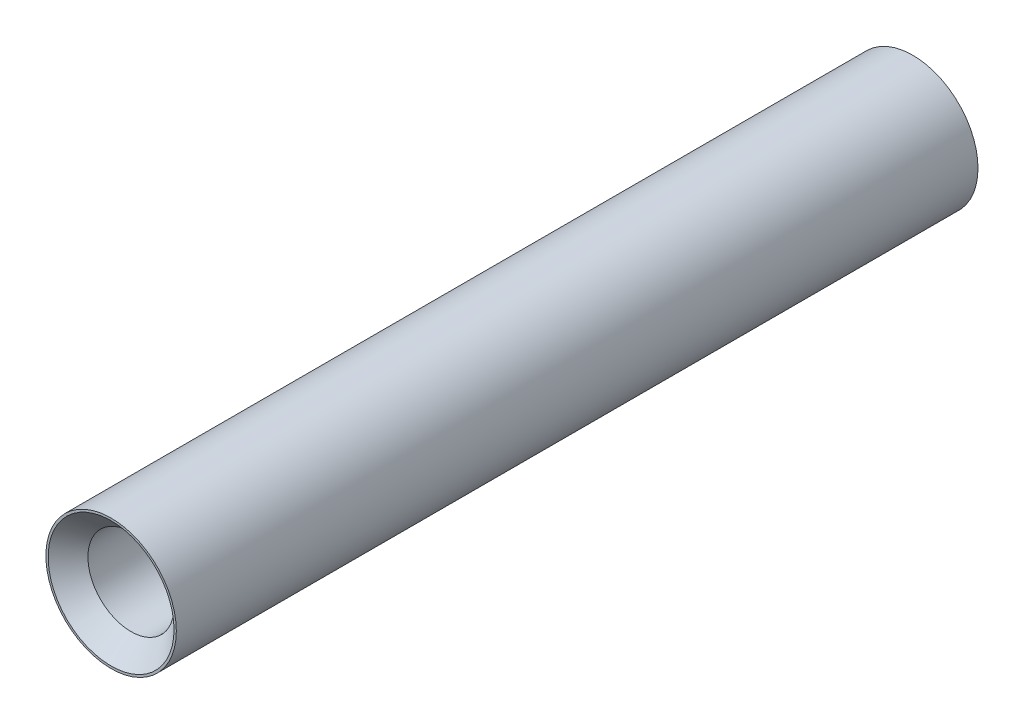
ISO-10303-21;
HEADER;
FILE_DESCRIPTION(('STEP AP214'),'2;1');
FILE_NAME('part.step','',(''),(''),'','','');
FILE_SCHEMA(('AUTOMOTIVE_DESIGN { 1 0 10303 214 1 1 1 1 }'));
ENDSEC;
DATA;
#1=APPLICATION_CONTEXT('core data for automotive mechanical design processes');
#2=APPLICATION_PROTOCOL_DEFINITION('international standard','automotive_design',2000,#1);
#3=PRODUCT_CONTEXT('',#1,'mechanical');
#4=PRODUCT('Part','Part','',(#3));
#5=PRODUCT_RELATED_PRODUCT_CATEGORY('part','',(#4));
#6=PRODUCT_DEFINITION_FORMATION('','',#4);
#7=PRODUCT_DEFINITION_CONTEXT('part definition',#1,'design');
#8=PRODUCT_DEFINITION('design','',#6,#7);
#9=PRODUCT_DEFINITION_SHAPE('','',#8);
#10=(LENGTH_UNIT() NAMED_UNIT(*) SI_UNIT(.MILLI.,.METRE.));
#11=(NAMED_UNIT(*) PLANE_ANGLE_UNIT() SI_UNIT($,.RADIAN.));
#12=(NAMED_UNIT(*) SI_UNIT($,.STERADIAN.) SOLID_ANGLE_UNIT());
#13=UNCERTAINTY_MEASURE_WITH_UNIT(LENGTH_MEASURE(1.E-05),#10,'distance_accuracy_value','');
#14=(GEOMETRIC_REPRESENTATION_CONTEXT(3) GLOBAL_UNCERTAINTY_ASSIGNED_CONTEXT((#13)) GLOBAL_UNIT_ASSIGNED_CONTEXT((#10,
#11,#12)) REPRESENTATION_CONTEXT('',''));
#15=CARTESIAN_POINT('',(0.,0.,0.));
#16=DIRECTION('',(0.,0.,1.));
#17=DIRECTION('',(1.,0.,0.));
#18=AXIS2_PLACEMENT_3D('',#15,#16,#17);
#19=CARTESIAN_POINT('',(0.,0.,43.02));
#20=DIRECTION('',(0.,0.,-1.));
#21=DIRECTION('',(-1.,0.,0.));
#22=AXIS2_PLACEMENT_3D('',#19,#20,#21);
#23=CYLINDRICAL_SURFACE('',#22,3.5);
#24=CARTESIAN_POINT('',(0.,0.,43.02));
#25=DIRECTION('',(0.,0.,1.));
#26=DIRECTION('',(1.,0.,0.));
#27=AXIS2_PLACEMENT_3D('',#24,#25,#26);
#28=CIRCLE('',#27,3.5);
#29=CARTESIAN_POINT('',(3.5,0.,43.02));
#30=VERTEX_POINT('',#29);
#31=EDGE_CURVE('E11',#30,#30,#28,.T.);
#32=ORIENTED_EDGE('',*,*,#31,.F.);
#33=EDGE_LOOP('',(#32));
#34=FACE_BOUND('',#33,.T.);
#35=CARTESIAN_POINT('',(0.,0.,0.));
#36=DIRECTION('',(0.,0.,1.));
#37=DIRECTION('',(1.,0.,0.));
#38=AXIS2_PLACEMENT_3D('',#35,#36,#37);
#39=CIRCLE('',#38,3.5);
#40=CARTESIAN_POINT('',(3.5,0.,0.));
#41=VERTEX_POINT('',#40);
#42=EDGE_CURVE('E40',#41,#41,#39,.T.);
#43=ORIENTED_EDGE('',*,*,#42,.T.);
#44=EDGE_LOOP('',(#43));
#45=FACE_BOUND('',#44,.T.);
#46=ADVANCED_FACE('F37',(#34,#45),#23,.T.);
#47=CARTESIAN_POINT('',(0.,0.,43.02));
#48=DIRECTION('',(0.,0.,1.));
#49=DIRECTION('',(1.,0.,0.));
#50=AXIS2_PLACEMENT_3D('',#47,#48,#49);
#51=PLANE('',#50);
#52=CARTESIAN_POINT('',(0.,0.,43.02));
#53=DIRECTION('',(0.,0.,1.));
#54=DIRECTION('',(1.,0.,0.));
#55=AXIS2_PLACEMENT_3D('',#52,#53,#54);
#56=CIRCLE('',#55,3.3782);
#57=CARTESIAN_POINT('',(3.3782,0.,43.02));
#58=VERTEX_POINT('',#57);
#59=EDGE_CURVE('E60',#58,#58,#56,.T.);
#60=ORIENTED_EDGE('',*,*,#59,.F.);
#61=EDGE_LOOP('',(#60));
#62=FACE_BOUND('',#61,.T.);
#63=ORIENTED_EDGE('',*,*,#31,.T.);
#64=EDGE_LOOP('',(#63));
#65=FACE_BOUND('',#64,.T.);
#66=ADVANCED_FACE('F84',(#62,#65),#51,.T.);
#67=CARTESIAN_POINT('',(0.,0.,0.));
#68=DIRECTION('',(0.,0.,1.));
#69=DIRECTION('',(1.,0.,0.));
#70=AXIS2_PLACEMENT_3D('',#67,#68,#69);
#71=PLANE('',#70);
#72=CARTESIAN_POINT('',(0.,0.,0.));
#73=DIRECTION('',(0.,0.,-1.));
#74=DIRECTION('',(-1.,0.,0.));
#75=AXIS2_PLACEMENT_3D('',#72,#73,#74);
#76=CIRCLE('',#75,3.3782);
#77=CARTESIAN_POINT('',(-3.3782,0.,0.));
#78=VERTEX_POINT('',#77);
#79=EDGE_CURVE('E67',#78,#78,#76,.T.);
#80=ORIENTED_EDGE('',*,*,#79,.F.);
#81=EDGE_LOOP('',(#80));
#82=FACE_BOUND('',#81,.T.);
#83=ORIENTED_EDGE('',*,*,#42,.F.);
#84=EDGE_LOOP('',(#83));
#85=FACE_BOUND('',#84,.T.);
#86=ADVANCED_FACE('F81',(#82,#85),#71,.F.);
#87=CARTESIAN_POINT('',(0.,0.,29.33));
#88=DIRECTION('',(0.,0.,1.));
#89=DIRECTION('',(1.,0.,0.));
#90=AXIS2_PLACEMENT_3D('',#87,#88,#89);
#91=CONICAL_SURFACE('',#90,2.3114,1.02974425867665);
#92=CARTESIAN_POINT('',(0.,0.,27.9411707651797));
#93=VERTEX_POINT('',#92);
#94=VERTEX_LOOP('',#93);
#95=FACE_BOUND('',#94,.T.);
#96=CARTESIAN_POINT('',(0.,0.,29.33));
#97=DIRECTION('',(0.,0.,1.));
#98=DIRECTION('',(1.,0.,0.));
#99=AXIS2_PLACEMENT_3D('',#96,#97,#98);
#100=CIRCLE('',#99,2.3114);
#101=CARTESIAN_POINT('',(2.3114,0.,29.33));
#102=VERTEX_POINT('',#101);
#103=EDGE_CURVE('E73',#102,#102,#100,.T.);
#104=ORIENTED_EDGE('',*,*,#103,.T.);
#105=EDGE_LOOP('',(#104));
#106=FACE_BOUND('',#105,.T.);
#107=ADVANCED_FACE('F83',(#95,#106),#91,.F.);
#108=CARTESIAN_POINT('',(0.,0.,43.02));
#109=DIRECTION('',(0.,0.,1.));
#110=DIRECTION('',(1.,0.,0.));
#111=AXIS2_PLACEMENT_3D('',#108,#109,#110);
#112=CYLINDRICAL_SURFACE('',#111,2.3114);
#113=ORIENTED_EDGE('',*,*,#103,.F.);
#114=EDGE_LOOP('',(#113));
#115=FACE_BOUND('',#114,.T.);
#116=CARTESIAN_POINT('',(0.,0.,41.9532));
#117=DIRECTION('',(0.,0.,1.));
#118=DIRECTION('',(1.,0.,0.));
#119=AXIS2_PLACEMENT_3D('',#116,#117,#118);
#120=CIRCLE('',#119,2.3114);
#121=CARTESIAN_POINT('',(2.3114,0.,41.9532));
#122=VERTEX_POINT('',#121);
#123=EDGE_CURVE('E64',#122,#122,#120,.T.);
#124=ORIENTED_EDGE('',*,*,#123,.T.);
#125=EDGE_LOOP('',(#124));
#126=FACE_BOUND('',#125,.T.);
#127=ADVANCED_FACE('F90',(#115,#126),#112,.F.);
#128=CARTESIAN_POINT('',(0.,0.,43.02));
#129=DIRECTION('',(0.,0.,1.));
#130=DIRECTION('',(1.,0.,0.));
#131=AXIS2_PLACEMENT_3D('',#128,#129,#130);
#132=CONICAL_SURFACE('',#131,3.3782,0.785398163397449);
#133=ORIENTED_EDGE('',*,*,#123,.F.);
#134=EDGE_LOOP('',(#133));
#135=FACE_BOUND('',#134,.T.);
#136=ORIENTED_EDGE('',*,*,#59,.T.);
#137=EDGE_LOOP('',(#136));
#138=FACE_BOUND('',#137,.T.);
#139=ADVANCED_FACE('F54',(#135,#138),#132,.F.);
#140=CARTESIAN_POINT('',(0.,0.,13.69));
#141=DIRECTION('',(0.,0.,-1.));
#142=DIRECTION('',(-1.,0.,0.));
#143=AXIS2_PLACEMENT_3D('',#140,#141,#142);
#144=CONICAL_SURFACE('',#143,2.3114,1.02974425867665);
#145=CARTESIAN_POINT('',(0.,0.,15.0788292348203));
#146=VERTEX_POINT('',#145);
#147=VERTEX_LOOP('',#146);
#148=FACE_BOUND('',#147,.T.);
#149=CARTESIAN_POINT('',(0.,0.,13.69));
#150=DIRECTION('',(0.,0.,-1.));
#151=DIRECTION('',(-1.,0.,0.));
#152=AXIS2_PLACEMENT_3D('',#149,#150,#151);
#153=CIRCLE('',#152,2.3114);
#154=CARTESIAN_POINT('',(-2.3114,0.,13.69));
#155=VERTEX_POINT('',#154);
#156=EDGE_CURVE('E58',#155,#155,#153,.T.);
#157=ORIENTED_EDGE('',*,*,#156,.T.);
#158=EDGE_LOOP('',(#157));
#159=FACE_BOUND('',#158,.T.);
#160=ADVANCED_FACE('F50',(#148,#159),#144,.F.);
#161=CARTESIAN_POINT('',(0.,0.,0.));
#162=DIRECTION('',(0.,0.,-1.));
#163=DIRECTION('',(-1.,0.,0.));
#164=AXIS2_PLACEMENT_3D('',#161,#162,#163);
#165=CYLINDRICAL_SURFACE('',#164,2.3114);
#166=ORIENTED_EDGE('',*,*,#156,.F.);
#167=EDGE_LOOP('',(#166));
#168=FACE_BOUND('',#167,.T.);
#169=CARTESIAN_POINT('',(0.,0.,1.0668));
#170=DIRECTION('',(0.,0.,-1.));
#171=DIRECTION('',(-1.,0.,0.));
#172=AXIS2_PLACEMENT_3D('',#169,#170,#171);
#173=CIRCLE('',#172,2.3114);
#174=CARTESIAN_POINT('',(-2.3114,0.,1.0668));
#175=VERTEX_POINT('',#174);
#176=EDGE_CURVE('E61',#175,#175,#173,.T.);
#177=ORIENTED_EDGE('',*,*,#176,.T.);
#178=EDGE_LOOP('',(#177));
#179=FACE_BOUND('',#178,.T.);
#180=ADVANCED_FACE('F53',(#168,#179),#165,.F.);
#181=CARTESIAN_POINT('',(0.,0.,0.));
#182=DIRECTION('',(0.,0.,-1.));
#183=DIRECTION('',(-1.,0.,0.));
#184=AXIS2_PLACEMENT_3D('',#181,#182,#183);
#185=CONICAL_SURFACE('',#184,3.3782,0.785398163397448);
#186=ORIENTED_EDGE('',*,*,#176,.F.);
#187=EDGE_LOOP('',(#186));
#188=FACE_BOUND('',#187,.T.);
#189=ORIENTED_EDGE('',*,*,#79,.T.);
#190=EDGE_LOOP('',(#189));
#191=FACE_BOUND('',#190,.T.);
#192=ADVANCED_FACE('F151',(#188,#191),#185,.F.);
#193=CLOSED_SHELL('',(#46,#66,#86,#107,#127,#139,#160,#180,#192));
#194=MANIFOLD_SOLID_BREP('B2',#193);
#195=ADVANCED_BREP_SHAPE_REPRESENTATION('',(#18,#194),#14);
#196=SHAPE_DEFINITION_REPRESENTATION(#9,#195);
ENDSEC;
END-ISO-10303-21;
